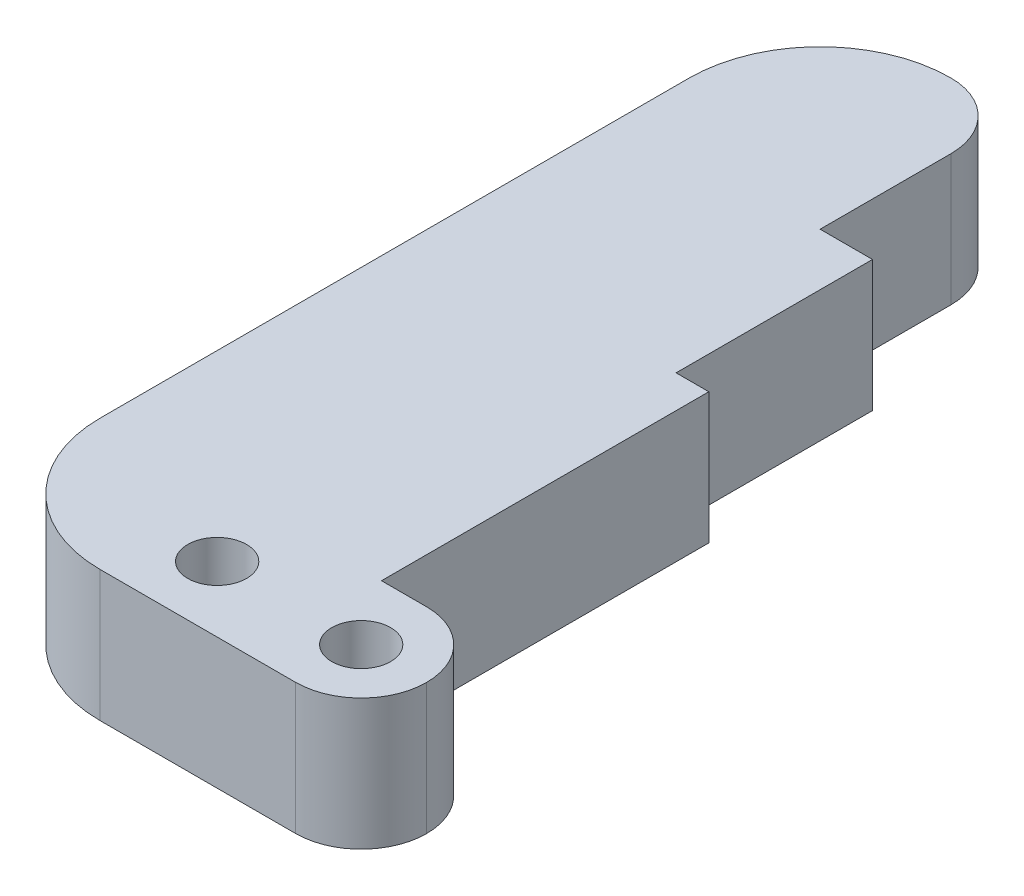
ISO-10303-21;
HEADER;
FILE_DESCRIPTION(('STEP AP214'),'2;1');
FILE_NAME('part.step','',(''),(''),'','','');
FILE_SCHEMA(('AUTOMOTIVE_DESIGN { 1 0 10303 214 1 1 1 1 }'));
ENDSEC;
DATA;
#1=APPLICATION_CONTEXT('core data for automotive mechanical design processes');
#2=APPLICATION_PROTOCOL_DEFINITION('international standard','automotive_design',2000,#1);
#3=PRODUCT_CONTEXT('',#1,'mechanical');
#4=PRODUCT('Part','Part','',(#3));
#5=PRODUCT_RELATED_PRODUCT_CATEGORY('part','',(#4));
#6=PRODUCT_DEFINITION_FORMATION('','',#4);
#7=PRODUCT_DEFINITION_CONTEXT('part definition',#1,'design');
#8=PRODUCT_DEFINITION('design','',#6,#7);
#9=PRODUCT_DEFINITION_SHAPE('','',#8);
#10=(LENGTH_UNIT() NAMED_UNIT(*) SI_UNIT(.MILLI.,.METRE.));
#11=(NAMED_UNIT(*) PLANE_ANGLE_UNIT() SI_UNIT($,.RADIAN.));
#12=(NAMED_UNIT(*) SI_UNIT($,.STERADIAN.) SOLID_ANGLE_UNIT());
#13=UNCERTAINTY_MEASURE_WITH_UNIT(LENGTH_MEASURE(1.E-05),#10,'distance_accuracy_value','');
#14=(GEOMETRIC_REPRESENTATION_CONTEXT(3) GLOBAL_UNCERTAINTY_ASSIGNED_CONTEXT((#13)) GLOBAL_UNIT_ASSIGNED_CONTEXT((#10,
#11,#12)) REPRESENTATION_CONTEXT('',''));
#15=CARTESIAN_POINT('',(0.,0.,0.));
#16=DIRECTION('',(0.,0.,1.));
#17=DIRECTION('',(1.,0.,0.));
#18=AXIS2_PLACEMENT_3D('',#15,#16,#17);
#19=CARTESIAN_POINT('',(-8.44999999999999,10.,-15.));
#20=DIRECTION('',(-1.,0.,0.));
#21=DIRECTION('',(0.,0.,1.));
#22=AXIS2_PLACEMENT_3D('',#19,#20,#21);
#23=PLANE('',#22);
#24=DIRECTION('',(0.,0.,-1.));
#25=VECTOR('',#24,1.);
#26=CARTESIAN_POINT('',(-8.44999999999999,0.,-15.));
#27=LINE('',#26,#25);
#28=CARTESIAN_POINT('',(-8.44999999999998,0.,10.));
#29=VERTEX_POINT('',#28);
#30=CARTESIAN_POINT('',(-8.44999999999999,0.,-15.));
#31=VERTEX_POINT('',#30);
#32=EDGE_CURVE('E152',#29,#31,#27,.T.);
#33=ORIENTED_EDGE('',*,*,#32,.T.);
#34=DIRECTION('',(0.,-1.,0.));
#35=VECTOR('',#34,1.);
#36=CARTESIAN_POINT('',(-8.44999999999999,10.,-15.));
#37=LINE('',#36,#35);
#38=CARTESIAN_POINT('',(-8.44999999999999,10.,-15.));
#39=VERTEX_POINT('',#38);
#40=EDGE_CURVE('E135',#39,#31,#37,.T.);
#41=ORIENTED_EDGE('',*,*,#40,.F.);
#42=DIRECTION('',(0.,0.,-1.));
#43=VECTOR('',#42,1.);
#44=CARTESIAN_POINT('',(-8.44999999999999,10.,-15.));
#45=LINE('',#44,#43);
#46=CARTESIAN_POINT('',(-8.44999999999998,10.,10.));
#47=VERTEX_POINT('',#46);
#48=EDGE_CURVE('E141',#47,#39,#45,.T.);
#49=ORIENTED_EDGE('',*,*,#48,.F.);
#50=DIRECTION('',(0.,-1.,0.));
#51=VECTOR('',#50,1.);
#52=CARTESIAN_POINT('',(-8.44999999999998,10.,10.));
#53=LINE('',#52,#51);
#54=EDGE_CURVE('E222',#47,#29,#53,.T.);
#55=ORIENTED_EDGE('',*,*,#54,.T.);
#56=EDGE_LOOP('',(#33,#41,#49,#55));
#57=FACE_BOUND('',#56,.T.);
#58=ADVANCED_FACE('F35',(#57),#23,.F.);
#59=CARTESIAN_POINT('',(-8.44999999999999,10.,-15.));
#60=DIRECTION('',(0.,0.,1.));
#61=DIRECTION('',(1.,0.,0.));
#62=AXIS2_PLACEMENT_3D('',#59,#60,#61);
#63=PLANE('',#62);
#64=DIRECTION('',(-1.,0.,0.));
#65=VECTOR('',#64,1.);
#66=CARTESIAN_POINT('',(-8.44999999999999,0.,-15.));
#67=LINE('',#66,#65);
#68=CARTESIAN_POINT('',(-10.95,0.,-15.));
#69=VERTEX_POINT('',#68);
#70=EDGE_CURVE('E224',#31,#69,#67,.T.);
#71=ORIENTED_EDGE('',*,*,#70,.T.);
#72=DIRECTION('',(0.,-1.,0.));
#73=VECTOR('',#72,1.);
#74=CARTESIAN_POINT('',(-10.95,10.,-15.));
#75=LINE('',#74,#73);
#76=CARTESIAN_POINT('',(-10.95,10.,-15.));
#77=VERTEX_POINT('',#76);
#78=EDGE_CURVE('E138',#77,#69,#75,.T.);
#79=ORIENTED_EDGE('',*,*,#78,.F.);
#80=DIRECTION('',(-1.,0.,0.));
#81=VECTOR('',#80,1.);
#82=CARTESIAN_POINT('',(-8.44999999999999,10.,-15.));
#83=LINE('',#82,#81);
#84=EDGE_CURVE('E131',#39,#77,#83,.T.);
#85=ORIENTED_EDGE('',*,*,#84,.F.);
#86=ORIENTED_EDGE('',*,*,#40,.T.);
#87=EDGE_LOOP('',(#71,#79,#85,#86));
#88=FACE_BOUND('',#87,.T.);
#89=ADVANCED_FACE('F133',(#88),#63,.F.);
#90=CARTESIAN_POINT('',(-10.95,10.,-15.));
#91=DIRECTION('',(-1.,0.,0.));
#92=DIRECTION('',(0.,0.,1.));
#93=AXIS2_PLACEMENT_3D('',#90,#91,#92);
#94=PLANE('',#93);
#95=DIRECTION('',(0.,0.,-1.));
#96=VECTOR('',#95,1.);
#97=CARTESIAN_POINT('',(-10.95,0.,-15.));
#98=LINE('',#97,#96);
#99=CARTESIAN_POINT('',(-10.95,0.,-30.));
#100=VERTEX_POINT('',#99);
#101=EDGE_CURVE('E227',#69,#100,#98,.T.);
#102=ORIENTED_EDGE('',*,*,#101,.T.);
#103=DIRECTION('',(0.,-1.,0.));
#104=VECTOR('',#103,1.);
#105=CARTESIAN_POINT('',(-10.95,10.,-30.));
#106=LINE('',#105,#104);
#107=CARTESIAN_POINT('',(-10.95,10.,-30.));
#108=VERTEX_POINT('',#107);
#109=EDGE_CURVE('E158',#108,#100,#106,.T.);
#110=ORIENTED_EDGE('',*,*,#109,.F.);
#111=DIRECTION('',(0.,0.,-1.));
#112=VECTOR('',#111,1.);
#113=CARTESIAN_POINT('',(-10.95,10.,-15.));
#114=LINE('',#113,#112);
#115=EDGE_CURVE('E140',#77,#108,#114,.T.);
#116=ORIENTED_EDGE('',*,*,#115,.F.);
#117=ORIENTED_EDGE('',*,*,#78,.T.);
#118=EDGE_LOOP('',(#102,#110,#116,#117));
#119=FACE_BOUND('',#118,.T.);
#120=ADVANCED_FACE('F259',(#119),#94,.F.);
#121=CARTESIAN_POINT('',(-10.95,10.,-30.));
#122=DIRECTION('',(0.,0.,1.));
#123=DIRECTION('',(1.,0.,0.));
#124=AXIS2_PLACEMENT_3D('',#121,#122,#123);
#125=PLANE('',#124);
#126=DIRECTION('',(-1.,0.,0.));
#127=VECTOR('',#126,1.);
#128=CARTESIAN_POINT('',(-10.95,0.,-30.));
#129=LINE('',#128,#127);
#130=CARTESIAN_POINT('',(-14.95,0.,-30.));
#131=VERTEX_POINT('',#130);
#132=EDGE_CURVE('E229',#100,#131,#129,.T.);
#133=ORIENTED_EDGE('',*,*,#132,.T.);
#134=DIRECTION('',(0.,-1.,0.));
#135=VECTOR('',#134,1.);
#136=CARTESIAN_POINT('',(-14.95,10.,-30.));
#137=LINE('',#136,#135);
#138=CARTESIAN_POINT('',(-14.95,10.,-30.));
#139=VERTEX_POINT('',#138);
#140=EDGE_CURVE('E239',#139,#131,#137,.T.);
#141=ORIENTED_EDGE('',*,*,#140,.F.);
#142=DIRECTION('',(-1.,0.,0.));
#143=VECTOR('',#142,1.);
#144=CARTESIAN_POINT('',(-10.95,10.,-30.));
#145=LINE('',#144,#143);
#146=EDGE_CURVE('E217',#108,#139,#145,.T.);
#147=ORIENTED_EDGE('',*,*,#146,.F.);
#148=ORIENTED_EDGE('',*,*,#109,.T.);
#149=EDGE_LOOP('',(#133,#141,#147,#148));
#150=FACE_BOUND('',#149,.T.);
#151=ADVANCED_FACE('F246',(#150),#125,.F.);
#152=CARTESIAN_POINT('',(-14.95,10.,-30.));
#153=DIRECTION('',(-1.,0.,0.));
#154=DIRECTION('',(0.,0.,1.));
#155=AXIS2_PLACEMENT_3D('',#152,#153,#154);
#156=PLANE('',#155);
#157=DIRECTION('',(0.,0.,-1.));
#158=VECTOR('',#157,1.);
#159=CARTESIAN_POINT('',(-14.95,0.,-30.));
#160=LINE('',#159,#158);
#161=CARTESIAN_POINT('',(-14.95,0.,-40.));
#162=VERTEX_POINT('',#161);
#163=EDGE_CURVE('E231',#131,#162,#160,.T.);
#164=ORIENTED_EDGE('',*,*,#163,.T.);
#165=DIRECTION('',(0.,-1.,0.));
#166=VECTOR('',#165,1.);
#167=CARTESIAN_POINT('',(-14.95,10.,-40.));
#168=LINE('',#167,#166);
#169=CARTESIAN_POINT('',(-14.95,10.,-40.));
#170=VERTEX_POINT('',#169);
#171=EDGE_CURVE('E44',#162,#170,#168,.F.);
#172=ORIENTED_EDGE('',*,*,#171,.T.);
#173=DIRECTION('',(0.,0.,-1.));
#174=VECTOR('',#173,1.);
#175=CARTESIAN_POINT('',(-14.95,10.,-30.));
#176=LINE('',#175,#174);
#177=EDGE_CURVE('E196',#139,#170,#176,.T.);
#178=ORIENTED_EDGE('',*,*,#177,.F.);
#179=ORIENTED_EDGE('',*,*,#140,.T.);
#180=EDGE_LOOP('',(#164,#172,#178,#179));
#181=FACE_BOUND('',#180,.T.);
#182=ADVANCED_FACE('F250',(#181),#156,.F.);
#183=CARTESIAN_POINT('',(-29.95,10.,20.));
#184=DIRECTION('',(1.,0.,0.));
#185=DIRECTION('',(0.,0.,-1.));
#186=AXIS2_PLACEMENT_3D('',#183,#184,#185);
#187=PLANE('',#186);
#188=DIRECTION('',(0.,0.,1.));
#189=VECTOR('',#188,1.);
#190=CARTESIAN_POINT('',(-29.95,0.,20.));
#191=LINE('',#190,#189);
#192=CARTESIAN_POINT('',(-29.95,0.,-35.));
#193=VERTEX_POINT('',#192);
#194=CARTESIAN_POINT('',(-29.95,0.,10.));
#195=VERTEX_POINT('',#194);
#196=EDGE_CURVE('E207',#193,#195,#191,.T.);
#197=ORIENTED_EDGE('',*,*,#196,.T.);
#198=DIRECTION('',(0.,-1.,0.));
#199=VECTOR('',#198,1.);
#200=CARTESIAN_POINT('',(-29.95,10.,10.));
#201=LINE('',#200,#199);
#202=CARTESIAN_POINT('',(-29.95,10.,10.));
#203=VERTEX_POINT('',#202);
#204=EDGE_CURVE('E169',#195,#203,#201,.F.);
#205=ORIENTED_EDGE('',*,*,#204,.T.);
#206=DIRECTION('',(0.,0.,1.));
#207=VECTOR('',#206,1.);
#208=CARTESIAN_POINT('',(-29.95,10.,20.));
#209=LINE('',#208,#207);
#210=CARTESIAN_POINT('',(-29.95,10.,-35.));
#211=VERTEX_POINT('',#210);
#212=EDGE_CURVE('E211',#211,#203,#209,.T.);
#213=ORIENTED_EDGE('',*,*,#212,.F.);
#214=DIRECTION('',(0.,-1.,0.));
#215=VECTOR('',#214,1.);
#216=CARTESIAN_POINT('',(-29.95,10.,-35.));
#217=LINE('',#216,#215);
#218=EDGE_CURVE('E166',#211,#193,#217,.T.);
#219=ORIENTED_EDGE('',*,*,#218,.T.);
#220=EDGE_LOOP('',(#197,#205,#213,#219));
#221=FACE_BOUND('',#220,.T.);
#222=ADVANCED_FACE('F209',(#221),#187,.F.);
#223=CARTESIAN_POINT('',(0.,10.,20.));
#224=DIRECTION('',(0.,0.,-1.));
#225=DIRECTION('',(-1.,0.,0.));
#226=AXIS2_PLACEMENT_3D('',#223,#224,#225);
#227=PLANE('',#226);
#228=DIRECTION('',(1.,0.,0.));
#229=VECTOR('',#228,1.);
#230=CARTESIAN_POINT('',(0.,0.,20.));
#231=LINE('',#230,#229);
#232=CARTESIAN_POINT('',(-19.95,0.,20.));
#233=VERTEX_POINT('',#232);
#234=CARTESIAN_POINT('',(-4.99999999999998,0.,20.));
#235=VERTEX_POINT('',#234);
#236=EDGE_CURVE('E234',#233,#235,#231,.T.);
#237=ORIENTED_EDGE('',*,*,#236,.T.);
#238=DIRECTION('',(0.,-1.,0.));
#239=VECTOR('',#238,1.);
#240=CARTESIAN_POINT('',(-4.99999999999998,10.,20.));
#241=LINE('',#240,#239);
#242=CARTESIAN_POINT('',(-4.99999999999998,10.,20.));
#243=VERTEX_POINT('',#242);
#244=EDGE_CURVE('E184',#235,#243,#241,.F.);
#245=ORIENTED_EDGE('',*,*,#244,.T.);
#246=DIRECTION('',(1.,0.,0.));
#247=VECTOR('',#246,1.);
#248=CARTESIAN_POINT('',(0.,10.,20.));
#249=LINE('',#248,#247);
#250=CARTESIAN_POINT('',(-19.95,10.,20.));
#251=VERTEX_POINT('',#250);
#252=EDGE_CURVE('E213',#251,#243,#249,.T.);
#253=ORIENTED_EDGE('',*,*,#252,.F.);
#254=DIRECTION('',(0.,-1.,0.));
#255=VECTOR('',#254,1.);
#256=CARTESIAN_POINT('',(-19.95,10.,20.));
#257=LINE('',#256,#255);
#258=EDGE_CURVE('E153',#251,#233,#257,.T.);
#259=ORIENTED_EDGE('',*,*,#258,.T.);
#260=EDGE_LOOP('',(#237,#245,#253,#259));
#261=FACE_BOUND('',#260,.T.);
#262=ADVANCED_FACE('F257',(#261),#227,.F.);
#263=CARTESIAN_POINT('',(0.,10.,10.));
#264=DIRECTION('',(0.,0.,1.));
#265=DIRECTION('',(1.,0.,0.));
#266=AXIS2_PLACEMENT_3D('',#263,#264,#265);
#267=PLANE('',#266);
#268=DIRECTION('',(-1.,0.,0.));
#269=VECTOR('',#268,1.);
#270=CARTESIAN_POINT('',(0.,10.,10.));
#271=LINE('',#270,#269);
#272=CARTESIAN_POINT('',(-4.99999999999999,10.,10.));
#273=VERTEX_POINT('',#272);
#274=EDGE_CURVE('E145',#273,#47,#271,.T.);
#275=ORIENTED_EDGE('',*,*,#274,.F.);
#276=DIRECTION('',(0.,-1.,0.));
#277=VECTOR('',#276,1.);
#278=CARTESIAN_POINT('',(-4.99999999999999,10.,10.));
#279=LINE('',#278,#277);
#280=CARTESIAN_POINT('',(-4.99999999999999,0.,10.));
#281=VERTEX_POINT('',#280);
#282=EDGE_CURVE('E11',#273,#281,#279,.T.);
#283=ORIENTED_EDGE('',*,*,#282,.T.);
#284=DIRECTION('',(-1.,0.,0.));
#285=VECTOR('',#284,1.);
#286=CARTESIAN_POINT('',(0.,0.,10.));
#287=LINE('',#286,#285);
#288=EDGE_CURVE('E149',#281,#29,#287,.T.);
#289=ORIENTED_EDGE('',*,*,#288,.T.);
#290=ORIENTED_EDGE('',*,*,#54,.F.);
#291=EDGE_LOOP('',(#275,#283,#289,#290));
#292=FACE_BOUND('',#291,.T.);
#293=ADVANCED_FACE('F290',(#292),#267,.F.);
#294=CARTESIAN_POINT('',(0.,10.,0.));
#295=DIRECTION('',(0.,-1.,0.));
#296=DIRECTION('',(0.,0.,-1.));
#297=AXIS2_PLACEMENT_3D('',#294,#295,#296);
#298=PLANE('',#297);
#299=CARTESIAN_POINT('',(-4.99999999999998,10.,15.));
#300=DIRECTION('',(0.,1.,0.));
#301=DIRECTION('',(0.,0.,1.));
#302=AXIS2_PLACEMENT_3D('',#299,#300,#301);
#303=CIRCLE('',#302,2.25);
#304=CARTESIAN_POINT('',(-4.99999999999998,10.,17.25));
#305=VERTEX_POINT('',#304);
#306=EDGE_CURVE('E299',#305,#305,#303,.T.);
#307=ORIENTED_EDGE('',*,*,#306,.F.);
#308=EDGE_LOOP('',(#307));
#309=FACE_BOUND('',#308,.T.);
#310=CARTESIAN_POINT('',(-16.,10.,15.));
#311=DIRECTION('',(0.,1.,0.));
#312=DIRECTION('',(0.,0.,1.));
#313=AXIS2_PLACEMENT_3D('',#310,#311,#312);
#314=CIRCLE('',#313,2.25);
#315=CARTESIAN_POINT('',(-16.,10.,17.25));
#316=VERTEX_POINT('',#315);
#317=EDGE_CURVE('E293',#316,#316,#314,.T.);
#318=ORIENTED_EDGE('',*,*,#317,.F.);
#319=EDGE_LOOP('',(#318));
#320=FACE_BOUND('',#319,.T.);
#321=ORIENTED_EDGE('',*,*,#177,.T.);
#322=CARTESIAN_POINT('',(-19.95,10.,-40.));
#323=DIRECTION('',(0.,-1.,0.));
#324=DIRECTION('',(0.,0.,-1.));
#325=AXIS2_PLACEMENT_3D('',#322,#323,#324);
#326=CIRCLE('',#325,5.);
#327=CARTESIAN_POINT('',(-19.95,10.,-45.));
#328=VERTEX_POINT('',#327);
#329=EDGE_CURVE('E190',#170,#328,#326,.F.);
#330=ORIENTED_EDGE('',*,*,#329,.T.);
#331=CARTESIAN_POINT('',(-19.95,10.,-35.));
#332=DIRECTION('',(0.,-1.,0.));
#333=DIRECTION('',(0.,0.,-1.));
#334=AXIS2_PLACEMENT_3D('',#331,#332,#333);
#335=CIRCLE('',#334,10.);
#336=EDGE_CURVE('E171',#328,#211,#335,.F.);
#337=ORIENTED_EDGE('',*,*,#336,.T.);
#338=ORIENTED_EDGE('',*,*,#212,.T.);
#339=CARTESIAN_POINT('',(-19.95,10.,10.));
#340=DIRECTION('',(0.,-1.,0.));
#341=DIRECTION('',(0.,0.,-1.));
#342=AXIS2_PLACEMENT_3D('',#339,#340,#341);
#343=CIRCLE('',#342,10.);
#344=EDGE_CURVE('E173',#203,#251,#343,.F.);
#345=ORIENTED_EDGE('',*,*,#344,.T.);
#346=ORIENTED_EDGE('',*,*,#252,.T.);
#347=CARTESIAN_POINT('',(-4.99999999999998,10.,15.));
#348=DIRECTION('',(0.,-1.,0.));
#349=DIRECTION('',(0.,0.,-1.));
#350=AXIS2_PLACEMENT_3D('',#347,#348,#349);
#351=CIRCLE('',#350,5.);
#352=CARTESIAN_POINT('',(0.,10.,15.));
#353=VERTEX_POINT('',#352);
#354=EDGE_CURVE('E188',#243,#353,#351,.F.);
#355=ORIENTED_EDGE('',*,*,#354,.T.);
#356=CARTESIAN_POINT('',(-4.99999999999998,10.,15.));
#357=DIRECTION('',(0.,-1.,0.));
#358=DIRECTION('',(0.,0.,-1.));
#359=AXIS2_PLACEMENT_3D('',#356,#357,#358);
#360=CIRCLE('',#359,5.);
#361=EDGE_CURVE('E58',#353,#273,#360,.F.);
#362=ORIENTED_EDGE('',*,*,#361,.T.);
#363=ORIENTED_EDGE('',*,*,#274,.T.);
#364=ORIENTED_EDGE('',*,*,#48,.T.);
#365=ORIENTED_EDGE('',*,*,#84,.T.);
#366=ORIENTED_EDGE('',*,*,#115,.T.);
#367=ORIENTED_EDGE('',*,*,#146,.T.);
#368=EDGE_LOOP('',(#321,#330,#337,#338,#345,#346,#355,#362,#363,#364,#365,#366,#367));
#369=FACE_BOUND('',#368,.T.);
#370=ADVANCED_FACE('F144',(#309,#320,#369),#298,.F.);
#371=CARTESIAN_POINT('',(0.,0.,0.));
#372=DIRECTION('',(0.,-1.,0.));
#373=DIRECTION('',(0.,0.,-1.));
#374=AXIS2_PLACEMENT_3D('',#371,#372,#373);
#375=PLANE('',#374);
#376=CARTESIAN_POINT('',(-4.99999999999998,0.,15.));
#377=DIRECTION('',(0.,1.,0.));
#378=DIRECTION('',(0.,0.,1.));
#379=AXIS2_PLACEMENT_3D('',#376,#377,#378);
#380=CIRCLE('',#379,2.25);
#381=CARTESIAN_POINT('',(-4.99999999999998,0.,17.25));
#382=VERTEX_POINT('',#381);
#383=EDGE_CURVE('E225',#382,#382,#380,.T.);
#384=ORIENTED_EDGE('',*,*,#383,.T.);
#385=EDGE_LOOP('',(#384));
#386=FACE_BOUND('',#385,.T.);
#387=CARTESIAN_POINT('',(-16.,0.,15.));
#388=DIRECTION('',(0.,1.,0.));
#389=DIRECTION('',(0.,0.,1.));
#390=AXIS2_PLACEMENT_3D('',#387,#388,#389);
#391=CIRCLE('',#390,2.25);
#392=CARTESIAN_POINT('',(-16.,0.,17.25));
#393=VERTEX_POINT('',#392);
#394=EDGE_CURVE('E296',#393,#393,#391,.T.);
#395=ORIENTED_EDGE('',*,*,#394,.T.);
#396=EDGE_LOOP('',(#395));
#397=FACE_BOUND('',#396,.T.);
#398=CARTESIAN_POINT('',(-19.95,0.,-35.));
#399=DIRECTION('',(0.,-1.,0.));
#400=DIRECTION('',(0.,0.,-1.));
#401=AXIS2_PLACEMENT_3D('',#398,#399,#400);
#402=CIRCLE('',#401,10.);
#403=CARTESIAN_POINT('',(-19.95,0.,-45.));
#404=VERTEX_POINT('',#403);
#405=EDGE_CURVE('E156',#193,#404,#402,.T.);
#406=ORIENTED_EDGE('',*,*,#405,.T.);
#407=CARTESIAN_POINT('',(-19.95,0.,-40.));
#408=DIRECTION('',(0.,-1.,0.));
#409=DIRECTION('',(0.,0.,-1.));
#410=AXIS2_PLACEMENT_3D('',#407,#408,#409);
#411=CIRCLE('',#410,5.);
#412=EDGE_CURVE('E182',#404,#162,#411,.T.);
#413=ORIENTED_EDGE('',*,*,#412,.T.);
#414=ORIENTED_EDGE('',*,*,#163,.F.);
#415=ORIENTED_EDGE('',*,*,#132,.F.);
#416=ORIENTED_EDGE('',*,*,#101,.F.);
#417=ORIENTED_EDGE('',*,*,#70,.F.);
#418=ORIENTED_EDGE('',*,*,#32,.F.);
#419=ORIENTED_EDGE('',*,*,#288,.F.);
#420=CARTESIAN_POINT('',(-4.99999999999998,0.,15.));
#421=DIRECTION('',(0.,-1.,0.));
#422=DIRECTION('',(0.,0.,-1.));
#423=AXIS2_PLACEMENT_3D('',#420,#421,#422);
#424=CIRCLE('',#423,5.);
#425=CARTESIAN_POINT('',(0.,0.,15.));
#426=VERTEX_POINT('',#425);
#427=EDGE_CURVE('E178',#281,#426,#424,.T.);
#428=ORIENTED_EDGE('',*,*,#427,.T.);
#429=CARTESIAN_POINT('',(-4.99999999999998,0.,15.));
#430=DIRECTION('',(0.,-1.,0.));
#431=DIRECTION('',(0.,0.,-1.));
#432=AXIS2_PLACEMENT_3D('',#429,#430,#431);
#433=CIRCLE('',#432,5.);
#434=EDGE_CURVE('E180',#426,#235,#433,.T.);
#435=ORIENTED_EDGE('',*,*,#434,.T.);
#436=ORIENTED_EDGE('',*,*,#236,.F.);
#437=CARTESIAN_POINT('',(-19.95,0.,10.));
#438=DIRECTION('',(0.,-1.,0.));
#439=DIRECTION('',(0.,0.,-1.));
#440=AXIS2_PLACEMENT_3D('',#437,#438,#439);
#441=CIRCLE('',#440,10.);
#442=EDGE_CURVE('E164',#233,#195,#441,.T.);
#443=ORIENTED_EDGE('',*,*,#442,.T.);
#444=ORIENTED_EDGE('',*,*,#196,.F.);
#445=EDGE_LOOP('',(#406,#413,#414,#415,#416,#417,#418,#419,#428,#435,#436,#443,#444));
#446=FACE_BOUND('',#445,.T.);
#447=ADVANCED_FACE('F205',(#386,#397,#446),#375,.T.);
#448=CARTESIAN_POINT('',(-16.,0.,15.));
#449=DIRECTION('',(0.,1.,0.));
#450=DIRECTION('',(0.,0.,1.));
#451=AXIS2_PLACEMENT_3D('',#448,#449,#450);
#452=CYLINDRICAL_SURFACE('',#451,2.25);
#453=ORIENTED_EDGE('',*,*,#394,.F.);
#454=EDGE_LOOP('',(#453));
#455=FACE_BOUND('',#454,.T.);
#456=ORIENTED_EDGE('',*,*,#317,.T.);
#457=EDGE_LOOP('',(#456));
#458=FACE_BOUND('',#457,.T.);
#459=ADVANCED_FACE('F309',(#455,#458),#452,.F.);
#460=CARTESIAN_POINT('',(-4.99999999999998,0.,15.));
#461=DIRECTION('',(0.,1.,0.));
#462=DIRECTION('',(0.,0.,1.));
#463=AXIS2_PLACEMENT_3D('',#460,#461,#462);
#464=CYLINDRICAL_SURFACE('',#463,2.25);
#465=ORIENTED_EDGE('',*,*,#383,.F.);
#466=EDGE_LOOP('',(#465));
#467=FACE_BOUND('',#466,.T.);
#468=ORIENTED_EDGE('',*,*,#306,.T.);
#469=EDGE_LOOP('',(#468));
#470=FACE_BOUND('',#469,.T.);
#471=ADVANCED_FACE('F272',(#467,#470),#464,.F.);
#472=CARTESIAN_POINT('',(-19.95,10.,10.));
#473=DIRECTION('',(0.,-1.,0.));
#474=DIRECTION('',(0.,0.,-1.));
#475=AXIS2_PLACEMENT_3D('',#472,#473,#474);
#476=CYLINDRICAL_SURFACE('',#475,10.);
#477=ORIENTED_EDGE('',*,*,#344,.F.);
#478=ORIENTED_EDGE('',*,*,#204,.F.);
#479=ORIENTED_EDGE('',*,*,#442,.F.);
#480=ORIENTED_EDGE('',*,*,#258,.F.);
#481=EDGE_LOOP('',(#477,#478,#479,#480));
#482=FACE_BOUND('',#481,.T.);
#483=ADVANCED_FACE('F269',(#482),#476,.T.);
#484=CARTESIAN_POINT('',(-19.95,10.,-35.));
#485=DIRECTION('',(0.,-1.,0.));
#486=DIRECTION('',(0.,0.,-1.));
#487=AXIS2_PLACEMENT_3D('',#484,#485,#486);
#488=CYLINDRICAL_SURFACE('',#487,10.);
#489=ORIENTED_EDGE('',*,*,#336,.F.);
#490=DIRECTION('',(0.,-1.,0.));
#491=VECTOR('',#490,1.);
#492=CARTESIAN_POINT('',(-19.95,10.,-45.));
#493=LINE('',#492,#491);
#494=EDGE_CURVE('E175',#404,#328,#493,.F.);
#495=ORIENTED_EDGE('',*,*,#494,.F.);
#496=ORIENTED_EDGE('',*,*,#405,.F.);
#497=ORIENTED_EDGE('',*,*,#218,.F.);
#498=EDGE_LOOP('',(#489,#495,#496,#497));
#499=FACE_BOUND('',#498,.T.);
#500=ADVANCED_FACE('F201',(#499),#488,.T.);
#501=CARTESIAN_POINT('',(-4.99999999999998,10.,15.));
#502=DIRECTION('',(0.,-1.,0.));
#503=DIRECTION('',(0.,0.,-1.));
#504=AXIS2_PLACEMENT_3D('',#501,#502,#503);
#505=CYLINDRICAL_SURFACE('',#504,5.);
#506=ORIENTED_EDGE('',*,*,#282,.F.);
#507=ORIENTED_EDGE('',*,*,#361,.F.);
#508=DIRECTION('',(0.,-1.,0.));
#509=VECTOR('',#508,1.);
#510=CARTESIAN_POINT('',(0.,10.,15.));
#511=LINE('',#510,#509);
#512=EDGE_CURVE('E39',#426,#353,#511,.F.);
#513=ORIENTED_EDGE('',*,*,#512,.F.);
#514=ORIENTED_EDGE('',*,*,#427,.F.);
#515=EDGE_LOOP('',(#506,#507,#513,#514));
#516=FACE_BOUND('',#515,.T.);
#517=ADVANCED_FACE('F276',(#516),#505,.T.);
#518=CARTESIAN_POINT('',(-4.99999999999998,10.,15.));
#519=DIRECTION('',(0.,-1.,0.));
#520=DIRECTION('',(0.,0.,-1.));
#521=AXIS2_PLACEMENT_3D('',#518,#519,#520);
#522=CYLINDRICAL_SURFACE('',#521,5.);
#523=ORIENTED_EDGE('',*,*,#354,.F.);
#524=ORIENTED_EDGE('',*,*,#244,.F.);
#525=ORIENTED_EDGE('',*,*,#434,.F.);
#526=ORIENTED_EDGE('',*,*,#512,.T.);
#527=EDGE_LOOP('',(#523,#524,#525,#526));
#528=FACE_BOUND('',#527,.T.);
#529=ADVANCED_FACE('F277',(#528),#522,.T.);
#530=CARTESIAN_POINT('',(-19.95,10.,-40.));
#531=DIRECTION('',(0.,-1.,0.));
#532=DIRECTION('',(0.,0.,-1.));
#533=AXIS2_PLACEMENT_3D('',#530,#531,#532);
#534=CYLINDRICAL_SURFACE('',#533,5.);
#535=ORIENTED_EDGE('',*,*,#329,.F.);
#536=ORIENTED_EDGE('',*,*,#171,.F.);
#537=ORIENTED_EDGE('',*,*,#412,.F.);
#538=ORIENTED_EDGE('',*,*,#494,.T.);
#539=EDGE_LOOP('',(#535,#536,#537,#538));
#540=FACE_BOUND('',#539,.T.);
#541=ADVANCED_FACE('F37',(#540),#534,.T.);
#542=CLOSED_SHELL('',(#58,#89,#120,#151,#182,#222,#262,#293,#370,#447,#459,#471,#483,#500,#517,
#529,#541));
#543=MANIFOLD_SOLID_BREP('B2',#542);
#544=ADVANCED_BREP_SHAPE_REPRESENTATION('',(#18,#543),#14);
#545=SHAPE_DEFINITION_REPRESENTATION(#9,#544);
ENDSEC;
END-ISO-10303-21;
